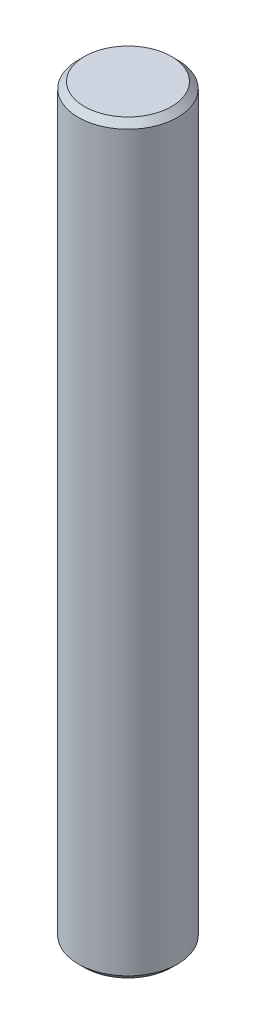
ISO-10303-21;
HEADER;
FILE_DESCRIPTION(('STEP AP214'),'2;1');
FILE_NAME('part.step','',(''),(''),'','','');
FILE_SCHEMA(('AUTOMOTIVE_DESIGN { 1 0 10303 214 1 1 1 1 }'));
ENDSEC;
DATA;
#1=APPLICATION_CONTEXT('core data for automotive mechanical design processes');
#2=APPLICATION_PROTOCOL_DEFINITION('international standard','automotive_design',2000,#1);
#3=PRODUCT_CONTEXT('',#1,'mechanical');
#4=PRODUCT('Part','Part','',(#3));
#5=PRODUCT_RELATED_PRODUCT_CATEGORY('part','',(#4));
#6=PRODUCT_DEFINITION_FORMATION('','',#4);
#7=PRODUCT_DEFINITION_CONTEXT('part definition',#1,'design');
#8=PRODUCT_DEFINITION('design','',#6,#7);
#9=PRODUCT_DEFINITION_SHAPE('','',#8);
#10=(LENGTH_UNIT() NAMED_UNIT(*) SI_UNIT(.MILLI.,.METRE.));
#11=(NAMED_UNIT(*) PLANE_ANGLE_UNIT() SI_UNIT($,.RADIAN.));
#12=(NAMED_UNIT(*) SI_UNIT($,.STERADIAN.) SOLID_ANGLE_UNIT());
#13=UNCERTAINTY_MEASURE_WITH_UNIT(LENGTH_MEASURE(1.E-05),#10,'distance_accuracy_value','');
#14=(GEOMETRIC_REPRESENTATION_CONTEXT(3) GLOBAL_UNCERTAINTY_ASSIGNED_CONTEXT((#13)) GLOBAL_UNIT_ASSIGNED_CONTEXT((#10,
#11,#12)) REPRESENTATION_CONTEXT('',''));
#15=CARTESIAN_POINT('',(0.,0.,0.));
#16=DIRECTION('',(0.,0.,1.));
#17=DIRECTION('',(1.,0.,0.));
#18=AXIS2_PLACEMENT_3D('',#15,#16,#17);
#19=CARTESIAN_POINT('',(0.,15.,0.));
#20=DIRECTION('',(0.,-1.,0.));
#21=DIRECTION('',(0.,0.,-1.));
#22=AXIS2_PLACEMENT_3D('',#19,#20,#21);
#23=CYLINDRICAL_SURFACE('',#22,2.);
#24=CARTESIAN_POINT('',(0.,-14.75,0.));
#25=DIRECTION('',(0.,1.,0.));
#26=DIRECTION('',(0.,0.,1.));
#27=AXIS2_PLACEMENT_3D('',#24,#25,#26);
#28=CIRCLE('',#27,2.);
#29=CARTESIAN_POINT('',(0.,-14.75,2.));
#30=VERTEX_POINT('',#29);
#31=EDGE_CURVE('E53',#30,#30,#28,.T.);
#32=ORIENTED_EDGE('',*,*,#31,.T.);
#33=EDGE_LOOP('',(#32));
#34=FACE_BOUND('',#33,.T.);
#35=CARTESIAN_POINT('',(0.,14.75,0.));
#36=DIRECTION('',(0.,1.,0.));
#37=DIRECTION('',(0.,0.,1.));
#38=AXIS2_PLACEMENT_3D('',#35,#36,#37);
#39=CIRCLE('',#38,2.);
#40=CARTESIAN_POINT('',(0.,14.75,2.));
#41=VERTEX_POINT('',#40);
#42=EDGE_CURVE('E58',#41,#41,#39,.F.);
#43=ORIENTED_EDGE('',*,*,#42,.T.);
#44=EDGE_LOOP('',(#43));
#45=FACE_BOUND('',#44,.T.);
#46=ADVANCED_FACE('F39',(#34,#45),#23,.T.);
#47=CARTESIAN_POINT('',(0.,15.,0.));
#48=DIRECTION('',(0.,1.,0.));
#49=DIRECTION('',(0.,0.,1.));
#50=AXIS2_PLACEMENT_3D('',#47,#48,#49);
#51=PLANE('',#50);
#52=CARTESIAN_POINT('',(0.,15.,0.));
#53=DIRECTION('',(0.,1.,0.));
#54=DIRECTION('',(0.,0.,1.));
#55=AXIS2_PLACEMENT_3D('',#52,#53,#54);
#56=CIRCLE('',#55,1.75);
#57=CARTESIAN_POINT('',(0.,15.,1.75));
#58=VERTEX_POINT('',#57);
#59=EDGE_CURVE('E10',#58,#58,#56,.T.);
#60=ORIENTED_EDGE('',*,*,#59,.T.);
#61=EDGE_LOOP('',(#60));
#62=FACE_BOUND('',#61,.T.);
#63=ADVANCED_FACE('F75',(#62),#51,.T.);
#64=CARTESIAN_POINT('',(0.,-15.,0.));
#65=DIRECTION('',(0.,1.,0.));
#66=DIRECTION('',(0.,0.,1.));
#67=AXIS2_PLACEMENT_3D('',#64,#65,#66);
#68=PLANE('',#67);
#69=CARTESIAN_POINT('',(0.,-15.,0.));
#70=DIRECTION('',(0.,1.,0.));
#71=DIRECTION('',(0.,0.,1.));
#72=AXIS2_PLACEMENT_3D('',#69,#70,#71);
#73=CIRCLE('',#72,1.75);
#74=CARTESIAN_POINT('',(0.,-15.,1.75));
#75=VERTEX_POINT('',#74);
#76=EDGE_CURVE('E48',#75,#75,#73,.F.);
#77=ORIENTED_EDGE('',*,*,#76,.T.);
#78=EDGE_LOOP('',(#77));
#79=FACE_BOUND('',#78,.T.);
#80=ADVANCED_FACE('F72',(#79),#68,.F.);
#81=CARTESIAN_POINT('',(0.,-14.75,0.));
#82=DIRECTION('',(0.,1.,0.));
#83=DIRECTION('',(0.,0.,1.));
#84=AXIS2_PLACEMENT_3D('',#81,#82,#83);
#85=CONICAL_SURFACE('',#84,2.,0.785398163397452);
#86=ORIENTED_EDGE('',*,*,#76,.F.);
#87=EDGE_LOOP('',(#86));
#88=FACE_BOUND('',#87,.T.);
#89=ORIENTED_EDGE('',*,*,#31,.F.);
#90=EDGE_LOOP('',(#89));
#91=FACE_BOUND('',#90,.T.);
#92=ADVANCED_FACE('F68',(#88,#91),#85,.T.);
#93=CARTESIAN_POINT('',(0.,15.,0.));
#94=DIRECTION('',(0.,-1.,0.));
#95=DIRECTION('',(0.,0.,-1.));
#96=AXIS2_PLACEMENT_3D('',#93,#94,#95);
#97=CONICAL_SURFACE('',#96,1.75,0.785398163397448);
#98=ORIENTED_EDGE('',*,*,#42,.F.);
#99=EDGE_LOOP('',(#98));
#100=FACE_BOUND('',#99,.T.);
#101=ORIENTED_EDGE('',*,*,#59,.F.);
#102=EDGE_LOOP('',(#101));
#103=FACE_BOUND('',#102,.T.);
#104=ADVANCED_FACE('F42',(#100,#103),#97,.T.);
#105=CLOSED_SHELL('',(#46,#63,#80,#92,#104));
#106=MANIFOLD_SOLID_BREP('B2',#105);
#107=ADVANCED_BREP_SHAPE_REPRESENTATION('',(#18,#106),#14);
#108=SHAPE_DEFINITION_REPRESENTATION(#9,#107);
ENDSEC;
END-ISO-10303-21;
